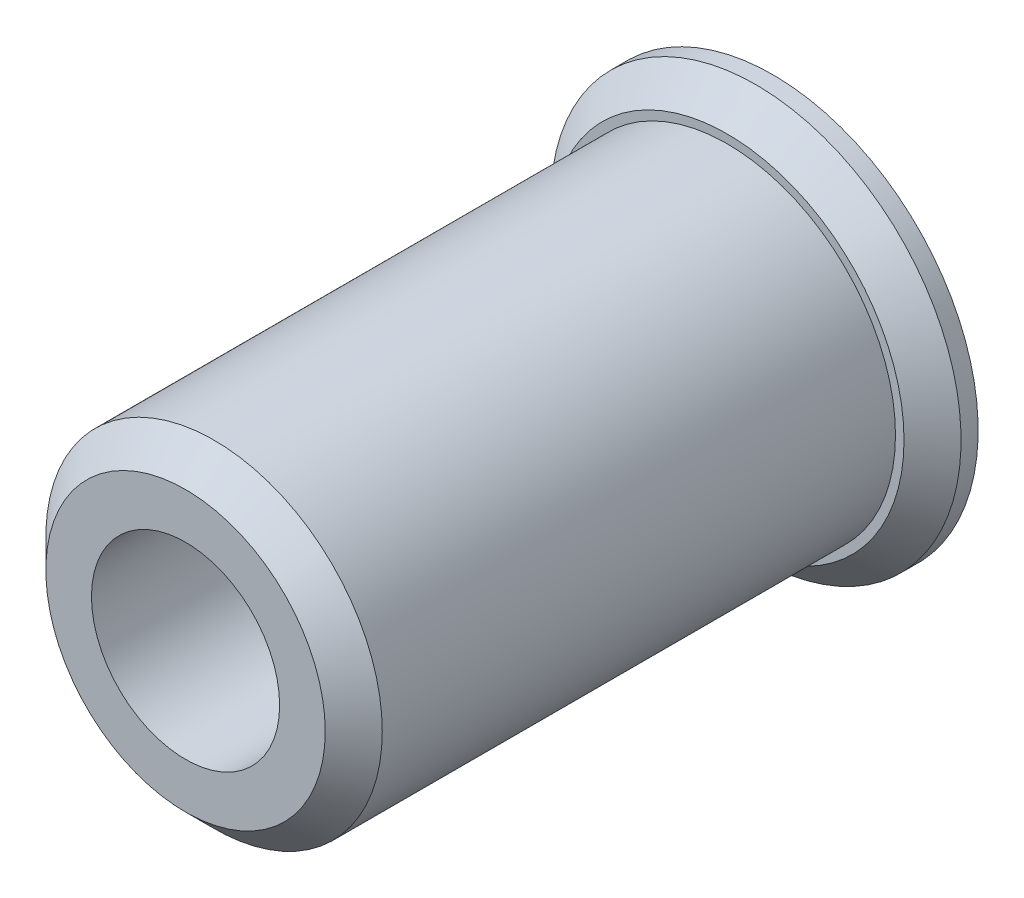
ISO-10303-21;
HEADER;
FILE_DESCRIPTION(('STEP AP214'),'2;1');
FILE_NAME('part.step','',(''),(''),'','','');
FILE_SCHEMA(('AUTOMOTIVE_DESIGN { 1 0 10303 214 1 1 1 1 }'));
ENDSEC;
DATA;
#1=APPLICATION_CONTEXT('core data for automotive mechanical design processes');
#2=APPLICATION_PROTOCOL_DEFINITION('international standard','automotive_design',2000,#1);
#3=PRODUCT_CONTEXT('',#1,'mechanical');
#4=PRODUCT('Part','Part','',(#3));
#5=PRODUCT_RELATED_PRODUCT_CATEGORY('part','',(#4));
#6=PRODUCT_DEFINITION_FORMATION('','',#4);
#7=PRODUCT_DEFINITION_CONTEXT('part definition',#1,'design');
#8=PRODUCT_DEFINITION('design','',#6,#7);
#9=PRODUCT_DEFINITION_SHAPE('','',#8);
#10=(LENGTH_UNIT() NAMED_UNIT(*) SI_UNIT(.MILLI.,.METRE.));
#11=(NAMED_UNIT(*) PLANE_ANGLE_UNIT() SI_UNIT($,.RADIAN.));
#12=(NAMED_UNIT(*) SI_UNIT($,.STERADIAN.) SOLID_ANGLE_UNIT());
#13=UNCERTAINTY_MEASURE_WITH_UNIT(LENGTH_MEASURE(1.E-05),#10,'distance_accuracy_value','');
#14=(GEOMETRIC_REPRESENTATION_CONTEXT(3) GLOBAL_UNCERTAINTY_ASSIGNED_CONTEXT((#13)) GLOBAL_UNIT_ASSIGNED_CONTEXT((#10,
#11,#12)) REPRESENTATION_CONTEXT('',''));
#15=CARTESIAN_POINT('',(0.,0.,0.));
#16=DIRECTION('',(0.,0.,1.));
#17=DIRECTION('',(1.,0.,0.));
#18=AXIS2_PLACEMENT_3D('',#15,#16,#17);
#19=CARTESIAN_POINT('',(0.,0.,10.3));
#20=DIRECTION('',(0.,0.,-1.));
#21=DIRECTION('',(-1.,0.,0.));
#22=AXIS2_PLACEMENT_3D('',#19,#20,#21);
#23=CYLINDRICAL_SURFACE('',#22,3.6);
#24=CARTESIAN_POINT('',(0.,0.,0.300000000000007));
#25=DIRECTION('',(0.,0.,1.));
#26=DIRECTION('',(1.,0.,0.));
#27=AXIS2_PLACEMENT_3D('',#24,#25,#26);
#28=CIRCLE('',#27,3.6);
#29=CARTESIAN_POINT('',(-3.6,0.,0.300000000000007));
#30=VERTEX_POINT('',#29);
#31=EDGE_CURVE('E44',#30,#30,#28,.F.);
#32=CARTESIAN_POINT('',(0.,0.,0.));
#33=DIRECTION('',(0.,0.,1.));
#34=DIRECTION('',(1.,0.,0.));
#35=AXIS2_PLACEMENT_3D('',#32,#33,#34);
#36=CIRCLE('',#35,3.6);
#37=CARTESIAN_POINT('',(-3.6,0.,0.));
#38=VERTEX_POINT('',#37);
#39=EDGE_CURVE('E53',#38,#38,#36,.T.);
#40=CARTESIAN_POINT('',(-3.6,0.,0.300000000000007));
#41=CARTESIAN_POINT('',(-3.6,0.,0.296875000000007));
#42=CARTESIAN_POINT('',(-3.6,0.,0.293750000000006));
#43=CARTESIAN_POINT('',(-3.6,0.,0.287500000000006));
#44=CARTESIAN_POINT('',(-3.6,0.,0.284375000000006));
#45=CARTESIAN_POINT('',(-3.6,0.,0.278125000000006));
#46=CARTESIAN_POINT('',(-3.6,0.,0.275000000000006));
#47=CARTESIAN_POINT('',(-3.6,0.,0.268750000000006));
#48=CARTESIAN_POINT('',(-3.6,0.,0.265625000000006));
#49=CARTESIAN_POINT('',(-3.6,0.,0.259375000000006));
#50=CARTESIAN_POINT('',(-3.6,0.,0.256250000000005));
#51=CARTESIAN_POINT('',(-3.6,0.,0.250000000000005));
#52=CARTESIAN_POINT('',(-3.6,0.,0.246875000000006));
#53=CARTESIAN_POINT('',(-3.6,0.,0.240625000000006));
#54=CARTESIAN_POINT('',(-3.6,0.,0.237500000000006));
#55=CARTESIAN_POINT('',(-3.6,0.,0.231250000000005));
#56=CARTESIAN_POINT('',(-3.6,0.,0.228125000000005));
#57=CARTESIAN_POINT('',(-3.6,0.,0.221875000000004));
#58=CARTESIAN_POINT('',(-3.6,0.,0.218750000000004));
#59=CARTESIAN_POINT('',(-3.6,0.,0.212500000000004));
#60=CARTESIAN_POINT('',(-3.6,0.,0.209375000000004));
#61=CARTESIAN_POINT('',(-3.6,0.,0.203125000000004));
#62=CARTESIAN_POINT('',(-3.6,0.,0.200000000000004));
#63=CARTESIAN_POINT('',(-3.6,0.,0.193750000000004));
#64=CARTESIAN_POINT('',(-3.6,0.,0.190625000000004));
#65=CARTESIAN_POINT('',(-3.6,0.,0.184375000000003));
#66=CARTESIAN_POINT('',(-3.6,0.,0.181250000000003));
#67=CARTESIAN_POINT('',(-3.6,0.,0.175000000000003));
#68=CARTESIAN_POINT('',(-3.6,0.,0.171875000000004));
#69=CARTESIAN_POINT('',(-3.6,0.,0.165625000000004));
#70=CARTESIAN_POINT('',(-3.6,0.,0.162500000000004));
#71=CARTESIAN_POINT('',(-3.6,0.,0.156250000000003));
#72=CARTESIAN_POINT('',(-3.6,0.,0.153125000000003));
#73=CARTESIAN_POINT('',(-3.6,0.,0.146875000000002));
#74=CARTESIAN_POINT('',(-3.6,0.,0.143750000000002));
#75=CARTESIAN_POINT('',(-3.6,0.,0.137500000000002));
#76=CARTESIAN_POINT('',(-3.6,0.,0.134375000000001));
#77=CARTESIAN_POINT('',(-3.6,0.,0.128125000000001));
#78=CARTESIAN_POINT('',(-3.6,0.,0.125000000000002));
#79=CARTESIAN_POINT('',(-3.6,0.,0.118750000000002));
#80=CARTESIAN_POINT('',(-3.6,0.,0.115625000000002));
#81=CARTESIAN_POINT('',(-3.6,0.,0.109375000000001));
#82=CARTESIAN_POINT('',(-3.6,0.,0.106250000000001));
#83=CARTESIAN_POINT('',(-3.6,0.,0.100000000000001));
#84=CARTESIAN_POINT('',(-3.6,0.,0.0968750000000015));
#85=CARTESIAN_POINT('',(-3.6,0.,0.0906250000000016));
#86=CARTESIAN_POINT('',(-3.6,0.,0.0875000000000014));
#87=CARTESIAN_POINT('',(-3.6,0.,0.0812500000000009));
#88=CARTESIAN_POINT('',(-3.6,0.,0.0781250000000007));
#89=CARTESIAN_POINT('',(-3.6,0.,0.0718750000000002));
#90=CARTESIAN_POINT('',(-3.6,0.,0.06875));
#91=CARTESIAN_POINT('',(-3.6,0.,0.0624999999999995));
#92=CARTESIAN_POINT('',(-3.6,0.,0.0593749999999992));
#93=CARTESIAN_POINT('',(-3.6,0.,0.0531249999999994));
#94=CARTESIAN_POINT('',(-3.6,0.,0.0499999999999997));
#95=CARTESIAN_POINT('',(-3.6,0.,0.0437499999999998));
#96=CARTESIAN_POINT('',(-3.6,0.,0.0406249999999996));
#97=CARTESIAN_POINT('',(-3.6,0.,0.0343749999999991));
#98=CARTESIAN_POINT('',(-3.6,0.,0.0312499999999989));
#99=CARTESIAN_POINT('',(-3.6,0.,0.024999999999999));
#100=CARTESIAN_POINT('',(-3.6,0.,0.0218749999999993));
#101=CARTESIAN_POINT('',(-3.6,0.,0.0156249999999994));
#102=CARTESIAN_POINT('',(-3.6,0.,0.0124999999999992));
#103=CARTESIAN_POINT('',(-3.6,0.,0.00624999999999873));
#104=CARTESIAN_POINT('',(-3.6,0.,0.0031249999999985));
#105=CARTESIAN_POINT('',(-3.6,0.,0.));
#106=B_SPLINE_CURVE_WITH_KNOTS('',3,(#40,#41,#42,#43,#44,#45,#46,#47,#48,#49,#50,#51,#52,#53,
#54,#55,#56,#57,#58,#59,#60,#61,#62,#63,#64,#65,#66,#67,#68,#69,#70,#71,#72,#73,#74,#75,#76,#77,
#78,#79,#80,#81,#82,#83,#84,#85,#86,#87,#88,#89,#90,#91,#92,#93,#94,#95,#96,#97,#98,#99,#100,
#101,#102,#103,#104,#105),.UNSPECIFIED.,.F.,.F.,(4,2,2,2,2,2,2,2,2,2,2,2,2,2,2,2,2,2,2,2,2,2,2,
2,2,2,2,2,2,2,2,2,4),(0.,0.0093750000000007,0.0187500000000014,0.0281250000000004,
0.0375000000000011,0.0468750000000018,0.0562500000000007,0.0656250000000014,0.0750000000000021,
0.0843750000000029,0.0937500000000036,0.103125000000003,0.112500000000003,0.121875000000004,
0.131250000000003,0.140625000000004,0.150000000000004,0.159375000000005,0.168750000000006,
0.178125000000005,0.187500000000005,0.196875000000006,0.206250000000005,0.215625000000006,
0.225000000000006,0.234375000000007,0.243750000000008,0.253125000000007,0.262500000000008,
0.271875000000008,0.281250000000007,0.290625000000008,0.300000000000009),.UNSPECIFIED.);
#107=EDGE_CURVE('BSEAM33',#30,#38,#106,.T.);
#108=ORIENTED_EDGE('',*,*,#31,.T.);
#109=ORIENTED_EDGE('',*,*,#39,.T.);
#110=ORIENTED_EDGE('',*,*,#107,.T.);
#111=ORIENTED_EDGE('',*,*,#107,.F.);
#112=EDGE_LOOP('',(#108,#110,#109,#111));
#113=FACE_BOUND('',#112,.T.);
#114=ADVANCED_FACE('F33',(#113),#23,.T.);
#115=CARTESIAN_POINT('',(0.,0.,0.));
#116=DIRECTION('',(0.,0.,1.));
#117=DIRECTION('',(1.,0.,0.));
#118=AXIS2_PLACEMENT_3D('',#115,#116,#117);
#119=PLANE('',#118);
#120=CARTESIAN_POINT('',(0.,0.,0.));
#121=DIRECTION('',(0.,0.,-1.));
#122=DIRECTION('',(-1.,0.,0.));
#123=AXIS2_PLACEMENT_3D('',#120,#121,#122);
#124=CIRCLE('',#123,1.65);
#125=CARTESIAN_POINT('',(-1.65,0.,0.));
#126=VERTEX_POINT('',#125);
#127=EDGE_CURVE('E62',#126,#126,#124,.T.);
#128=ORIENTED_EDGE('',*,*,#127,.F.);
#129=EDGE_LOOP('',(#128));
#130=FACE_BOUND('',#129,.T.);
#131=ORIENTED_EDGE('',*,*,#39,.F.);
#132=EDGE_LOOP('',(#131));
#133=FACE_BOUND('',#132,.T.);
#134=ADVANCED_FACE('F68',(#130,#133),#119,.F.);
#135=CARTESIAN_POINT('',(0.,0.,0.8));
#136=DIRECTION('',(0.,0.,1.));
#137=DIRECTION('',(1.,0.,0.));
#138=AXIS2_PLACEMENT_3D('',#135,#136,#137);
#139=PLANE('',#138);
#140=CARTESIAN_POINT('',(0.,0.,0.8));
#141=DIRECTION('',(0.,0.,1.));
#142=DIRECTION('',(1.,0.,0.));
#143=AXIS2_PLACEMENT_3D('',#140,#141,#142);
#144=CIRCLE('',#143,3.10000000000001);
#145=CARTESIAN_POINT('',(3.10000000000001,0.,0.8));
#146=VERTEX_POINT('',#145);
#147=EDGE_CURVE('E48',#146,#146,#144,.T.);
#148=ORIENTED_EDGE('',*,*,#147,.T.);
#149=EDGE_LOOP('',(#148));
#150=FACE_BOUND('',#149,.T.);
#151=CARTESIAN_POINT('',(0.,0.,0.8));
#152=DIRECTION('',(0.,0.,1.));
#153=DIRECTION('',(1.,0.,0.));
#154=AXIS2_PLACEMENT_3D('',#151,#152,#153);
#155=CIRCLE('',#154,2.95);
#156=CARTESIAN_POINT('',(2.95,0.,0.8));
#157=VERTEX_POINT('',#156);
#158=EDGE_CURVE('E56',#157,#157,#155,.T.);
#159=ORIENTED_EDGE('',*,*,#158,.F.);
#160=EDGE_LOOP('',(#159));
#161=FACE_BOUND('',#160,.T.);
#162=ADVANCED_FACE('F71',(#150,#161),#139,.T.);
#163=CARTESIAN_POINT('',(0.,0.,0.8));
#164=DIRECTION('',(0.,0.,1.));
#165=DIRECTION('',(1.,0.,0.));
#166=AXIS2_PLACEMENT_3D('',#163,#164,#165);
#167=CYLINDRICAL_SURFACE('',#166,2.95);
#168=CARTESIAN_POINT('',(0.,0.,9.8));
#169=DIRECTION('',(0.,0.,1.));
#170=DIRECTION('',(1.,0.,0.));
#171=AXIS2_PLACEMENT_3D('',#168,#169,#170);
#172=CIRCLE('',#171,2.95);
#173=CARTESIAN_POINT('',(2.95,0.,9.8));
#174=VERTEX_POINT('',#173);
#175=EDGE_CURVE('E11',#174,#174,#172,.F.);
#176=ORIENTED_EDGE('',*,*,#175,.T.);
#177=EDGE_LOOP('',(#176));
#178=FACE_BOUND('',#177,.T.);
#179=ORIENTED_EDGE('',*,*,#158,.T.);
#180=EDGE_LOOP('',(#179));
#181=FACE_BOUND('',#180,.T.);
#182=ADVANCED_FACE('F98',(#178,#181),#167,.T.);
#183=CARTESIAN_POINT('',(0.,0.,10.3));
#184=DIRECTION('',(0.,0.,1.));
#185=DIRECTION('',(1.,0.,0.));
#186=AXIS2_PLACEMENT_3D('',#183,#184,#185);
#187=PLANE('',#186);
#188=CARTESIAN_POINT('',(0.,0.,10.3));
#189=DIRECTION('',(0.,0.,1.));
#190=DIRECTION('',(1.,0.,0.));
#191=AXIS2_PLACEMENT_3D('',#188,#189,#190);
#192=CIRCLE('',#191,2.45);
#193=CARTESIAN_POINT('',(2.45,0.,10.3));
#194=VERTEX_POINT('',#193);
#195=EDGE_CURVE('E40',#194,#194,#192,.T.);
#196=ORIENTED_EDGE('',*,*,#195,.T.);
#197=EDGE_LOOP('',(#196));
#198=FACE_BOUND('',#197,.T.);
#199=CARTESIAN_POINT('',(0.,0.,10.3));
#200=DIRECTION('',(0.,0.,-1.));
#201=DIRECTION('',(-1.,0.,0.));
#202=AXIS2_PLACEMENT_3D('',#199,#200,#201);
#203=CIRCLE('',#202,1.65);
#204=CARTESIAN_POINT('',(-1.65,0.,10.3));
#205=VERTEX_POINT('',#204);
#206=EDGE_CURVE('E59',#205,#205,#203,.T.);
#207=ORIENTED_EDGE('',*,*,#206,.T.);
#208=EDGE_LOOP('',(#207));
#209=FACE_BOUND('',#208,.T.);
#210=ADVANCED_FACE('F89',(#198,#209),#187,.T.);
#211=CARTESIAN_POINT('',(0.,0.,0.));
#212=DIRECTION('',(0.,0.,-1.));
#213=DIRECTION('',(-1.,0.,0.));
#214=AXIS2_PLACEMENT_3D('',#211,#212,#213);
#215=CYLINDRICAL_SURFACE('',#214,1.65);
#216=ORIENTED_EDGE('',*,*,#206,.F.);
#217=EDGE_LOOP('',(#216));
#218=FACE_BOUND('',#217,.T.);
#219=ORIENTED_EDGE('',*,*,#127,.T.);
#220=EDGE_LOOP('',(#219));
#221=FACE_BOUND('',#220,.T.);
#222=ADVANCED_FACE('F66',(#218,#221),#215,.F.);
#223=CARTESIAN_POINT('',(0.,0.,0.8));
#224=DIRECTION('',(0.,0.,-1.));
#225=DIRECTION('',(-1.,0.,0.));
#226=AXIS2_PLACEMENT_3D('',#223,#224,#225);
#227=CONICAL_SURFACE('',#226,3.10000000000001,0.785398163397446);
#228=ORIENTED_EDGE('',*,*,#31,.F.);
#229=EDGE_LOOP('',(#228));
#230=FACE_BOUND('',#229,.T.);
#231=ORIENTED_EDGE('',*,*,#147,.F.);
#232=EDGE_LOOP('',(#231));
#233=FACE_BOUND('',#232,.T.);
#234=ADVANCED_FACE('F81',(#230,#233),#227,.T.);
#235=CARTESIAN_POINT('',(0.,0.,10.3));
#236=DIRECTION('',(0.,0.,-1.));
#237=DIRECTION('',(-1.,0.,0.));
#238=AXIS2_PLACEMENT_3D('',#235,#236,#237);
#239=CONICAL_SURFACE('',#238,2.45,0.785398163397446);
#240=ORIENTED_EDGE('',*,*,#175,.F.);
#241=EDGE_LOOP('',(#240));
#242=FACE_BOUND('',#241,.T.);
#243=ORIENTED_EDGE('',*,*,#195,.F.);
#244=EDGE_LOOP('',(#243));
#245=FACE_BOUND('',#244,.T.);
#246=ADVANCED_FACE('F35',(#242,#245),#239,.T.);
#247=CLOSED_SHELL('',(#114,#134,#162,#182,#210,#222,#234,#246));
#248=MANIFOLD_SOLID_BREP('B2',#247);
#249=ADVANCED_BREP_SHAPE_REPRESENTATION('',(#18,#248),#14);
#250=SHAPE_DEFINITION_REPRESENTATION(#9,#249);
ENDSEC;
END-ISO-10303-21;
